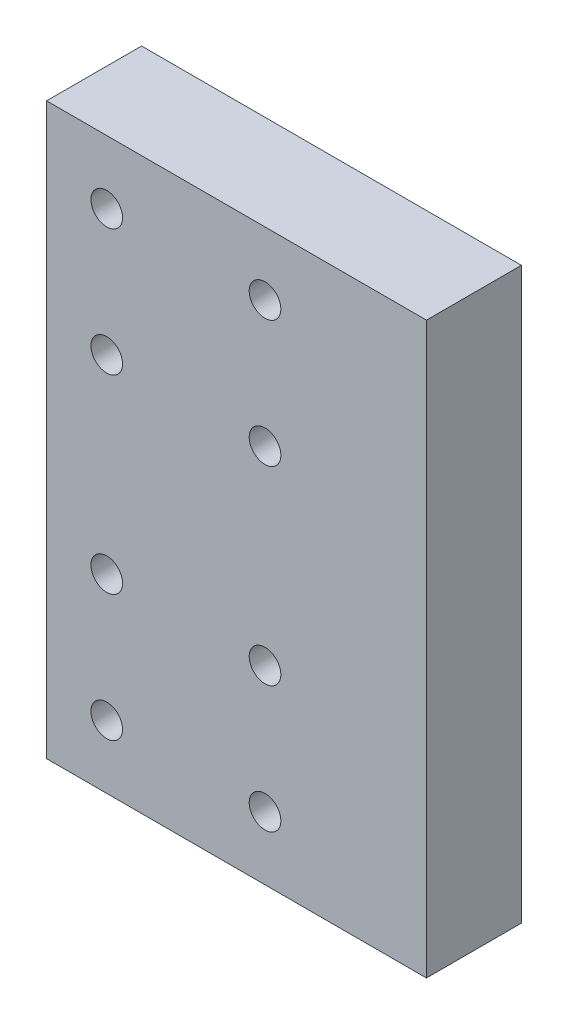
ISO-10303-21;
HEADER;
FILE_DESCRIPTION(('STEP AP214'),'2;1');
FILE_NAME('part.step','',(''),(''),'','','');
FILE_SCHEMA(('AUTOMOTIVE_DESIGN { 1 0 10303 214 1 1 1 1 }'));
ENDSEC;
DATA;
#1=APPLICATION_CONTEXT('core data for automotive mechanical design processes');
#2=APPLICATION_PROTOCOL_DEFINITION('international standard','automotive_design',2000,#1);
#3=PRODUCT_CONTEXT('',#1,'mechanical');
#4=PRODUCT('Part','Part','',(#3));
#5=PRODUCT_RELATED_PRODUCT_CATEGORY('part','',(#4));
#6=PRODUCT_DEFINITION_FORMATION('','',#4);
#7=PRODUCT_DEFINITION_CONTEXT('part definition',#1,'design');
#8=PRODUCT_DEFINITION('design','',#6,#7);
#9=PRODUCT_DEFINITION_SHAPE('','',#8);
#10=(LENGTH_UNIT() NAMED_UNIT(*) SI_UNIT(.MILLI.,.METRE.));
#11=(NAMED_UNIT(*) PLANE_ANGLE_UNIT() SI_UNIT($,.RADIAN.));
#12=(NAMED_UNIT(*) SI_UNIT($,.STERADIAN.) SOLID_ANGLE_UNIT());
#13=UNCERTAINTY_MEASURE_WITH_UNIT(LENGTH_MEASURE(1.E-05),#10,'distance_accuracy_value','');
#14=(GEOMETRIC_REPRESENTATION_CONTEXT(3) GLOBAL_UNCERTAINTY_ASSIGNED_CONTEXT((#13)) GLOBAL_UNIT_ASSIGNED_CONTEXT((#10,
#11,#12)) REPRESENTATION_CONTEXT('',''));
#15=CARTESIAN_POINT('',(0.,0.,0.));
#16=DIRECTION('',(0.,0.,1.));
#17=DIRECTION('',(1.,0.,0.));
#18=AXIS2_PLACEMENT_3D('',#15,#16,#17);
#19=CARTESIAN_POINT('',(0.,0.,15.));
#20=DIRECTION('',(1.,0.,0.));
#21=DIRECTION('',(0.,0.,-1.));
#22=AXIS2_PLACEMENT_3D('',#19,#20,#21);
#23=PLANE('',#22);
#24=DIRECTION('',(0.,-1.,0.));
#25=VECTOR('',#24,1.);
#26=CARTESIAN_POINT('',(0.,0.,0.));
#27=LINE('',#26,#25);
#28=CARTESIAN_POINT('',(0.,90.,0.));
#29=VERTEX_POINT('',#28);
#30=CARTESIAN_POINT('',(0.,0.,0.));
#31=VERTEX_POINT('',#30);
#32=EDGE_CURVE('E96',#29,#31,#27,.T.);
#33=ORIENTED_EDGE('',*,*,#32,.T.);
#34=DIRECTION('',(0.,0.,-1.));
#35=VECTOR('',#34,1.);
#36=CARTESIAN_POINT('',(0.,0.,15.));
#37=LINE('',#36,#35);
#38=CARTESIAN_POINT('',(0.,0.,15.));
#39=VERTEX_POINT('',#38);
#40=EDGE_CURVE('E11',#39,#31,#37,.T.);
#41=ORIENTED_EDGE('',*,*,#40,.F.);
#42=DIRECTION('',(0.,-1.,0.));
#43=VECTOR('',#42,1.);
#44=CARTESIAN_POINT('',(0.,0.,15.));
#45=LINE('',#44,#43);
#46=CARTESIAN_POINT('',(0.,90.,15.));
#47=VERTEX_POINT('',#46);
#48=EDGE_CURVE('E84',#47,#39,#45,.T.);
#49=ORIENTED_EDGE('',*,*,#48,.F.);
#50=DIRECTION('',(0.,0.,-1.));
#51=VECTOR('',#50,1.);
#52=CARTESIAN_POINT('',(0.,90.,15.));
#53=LINE('',#52,#51);
#54=EDGE_CURVE('E92',#47,#29,#53,.T.);
#55=ORIENTED_EDGE('',*,*,#54,.T.);
#56=EDGE_LOOP('',(#33,#41,#49,#55));
#57=FACE_BOUND('',#56,.T.);
#58=ADVANCED_FACE('F33',(#57),#23,.F.);
#59=CARTESIAN_POINT('',(0.,0.,15.));
#60=DIRECTION('',(0.,1.,0.));
#61=DIRECTION('',(0.,0.,1.));
#62=AXIS2_PLACEMENT_3D('',#59,#60,#61);
#63=PLANE('',#62);
#64=DIRECTION('',(1.,0.,0.));
#65=VECTOR('',#64,1.);
#66=CARTESIAN_POINT('',(0.,0.,0.));
#67=LINE('',#66,#65);
#68=CARTESIAN_POINT('',(60.,0.,0.));
#69=VERTEX_POINT('',#68);
#70=EDGE_CURVE('E88',#31,#69,#67,.T.);
#71=ORIENTED_EDGE('',*,*,#70,.T.);
#72=DIRECTION('',(0.,0.,-1.));
#73=VECTOR('',#72,1.);
#74=CARTESIAN_POINT('',(60.,0.,15.));
#75=LINE('',#74,#73);
#76=CARTESIAN_POINT('',(60.,0.,15.));
#77=VERTEX_POINT('',#76);
#78=EDGE_CURVE('E41',#77,#69,#75,.T.);
#79=ORIENTED_EDGE('',*,*,#78,.F.);
#80=DIRECTION('',(1.,0.,0.));
#81=VECTOR('',#80,1.);
#82=CARTESIAN_POINT('',(0.,0.,15.));
#83=LINE('',#82,#81);
#84=EDGE_CURVE('E79',#39,#77,#83,.T.);
#85=ORIENTED_EDGE('',*,*,#84,.F.);
#86=ORIENTED_EDGE('',*,*,#40,.T.);
#87=EDGE_LOOP('',(#71,#79,#85,#86));
#88=FACE_BOUND('',#87,.T.);
#89=ADVANCED_FACE('F87',(#88),#63,.F.);
#90=CARTESIAN_POINT('',(60.,0.,15.));
#91=DIRECTION('',(-1.,0.,0.));
#92=DIRECTION('',(0.,0.,1.));
#93=AXIS2_PLACEMENT_3D('',#90,#91,#92);
#94=PLANE('',#93);
#95=DIRECTION('',(0.,1.,0.));
#96=VECTOR('',#95,1.);
#97=CARTESIAN_POINT('',(60.,0.,0.));
#98=LINE('',#97,#96);
#99=CARTESIAN_POINT('',(60.,90.,0.));
#100=VERTEX_POINT('',#99);
#101=EDGE_CURVE('E66',#69,#100,#98,.T.);
#102=ORIENTED_EDGE('',*,*,#101,.T.);
#103=DIRECTION('',(0.,0.,-1.));
#104=VECTOR('',#103,1.);
#105=CARTESIAN_POINT('',(60.,90.,15.));
#106=LINE('',#105,#104);
#107=CARTESIAN_POINT('',(60.,90.,15.));
#108=VERTEX_POINT('',#107);
#109=EDGE_CURVE('E89',#108,#100,#106,.T.);
#110=ORIENTED_EDGE('',*,*,#109,.F.);
#111=DIRECTION('',(0.,1.,0.));
#112=VECTOR('',#111,1.);
#113=CARTESIAN_POINT('',(60.,0.,15.));
#114=LINE('',#113,#112);
#115=EDGE_CURVE('E82',#77,#108,#114,.T.);
#116=ORIENTED_EDGE('',*,*,#115,.F.);
#117=ORIENTED_EDGE('',*,*,#78,.T.);
#118=EDGE_LOOP('',(#102,#110,#116,#117));
#119=FACE_BOUND('',#118,.T.);
#120=ADVANCED_FACE('F90',(#119),#94,.F.);
#121=CARTESIAN_POINT('',(0.,90.,15.));
#122=DIRECTION('',(0.,-1.,0.));
#123=DIRECTION('',(0.,0.,-1.));
#124=AXIS2_PLACEMENT_3D('',#121,#122,#123);
#125=PLANE('',#124);
#126=DIRECTION('',(-1.,0.,0.));
#127=VECTOR('',#126,1.);
#128=CARTESIAN_POINT('',(0.,90.,0.));
#129=LINE('',#128,#127);
#130=EDGE_CURVE('E72',#100,#29,#129,.T.);
#131=ORIENTED_EDGE('',*,*,#130,.T.);
#132=ORIENTED_EDGE('',*,*,#54,.F.);
#133=DIRECTION('',(-1.,0.,0.));
#134=VECTOR('',#133,1.);
#135=CARTESIAN_POINT('',(0.,90.,15.));
#136=LINE('',#135,#134);
#137=EDGE_CURVE('E49',#108,#47,#136,.T.);
#138=ORIENTED_EDGE('',*,*,#137,.F.);
#139=ORIENTED_EDGE('',*,*,#109,.T.);
#140=EDGE_LOOP('',(#131,#132,#138,#139));
#141=FACE_BOUND('',#140,.T.);
#142=ADVANCED_FACE('F104',(#141),#125,.F.);
#143=CARTESIAN_POINT('',(0.,0.,15.));
#144=DIRECTION('',(0.,0.,-1.));
#145=DIRECTION('',(-1.,0.,0.));
#146=AXIS2_PLACEMENT_3D('',#143,#144,#145);
#147=PLANE('',#146);
#148=CARTESIAN_POINT('',(34.5,10.,15.));
#149=DIRECTION('',(0.,0.,-1.));
#150=DIRECTION('',(-1.,0.,0.));
#151=AXIS2_PLACEMENT_3D('',#148,#149,#150);
#152=CIRCLE('',#151,2.5);
#153=CARTESIAN_POINT('',(32.,10.,15.));
#154=VERTEX_POINT('',#153);
#155=EDGE_CURVE('E115',#154,#154,#152,.T.);
#156=ORIENTED_EDGE('',*,*,#155,.T.);
#157=EDGE_LOOP('',(#156));
#158=FACE_BOUND('',#157,.T.);
#159=CARTESIAN_POINT('',(34.5,30.,15.));
#160=DIRECTION('',(0.,0.,-1.));
#161=DIRECTION('',(-1.,0.,0.));
#162=AXIS2_PLACEMENT_3D('',#159,#160,#161);
#163=CIRCLE('',#162,2.49999999999999);
#164=CARTESIAN_POINT('',(32.,30.,15.));
#165=VERTEX_POINT('',#164);
#166=EDGE_CURVE('E118',#165,#165,#163,.T.);
#167=ORIENTED_EDGE('',*,*,#166,.T.);
#168=EDGE_LOOP('',(#167));
#169=FACE_BOUND('',#168,.T.);
#170=CARTESIAN_POINT('',(9.5,30.,15.));
#171=DIRECTION('',(0.,0.,-1.));
#172=DIRECTION('',(-1.,0.,0.));
#173=AXIS2_PLACEMENT_3D('',#170,#171,#172);
#174=CIRCLE('',#173,2.5);
#175=CARTESIAN_POINT('',(7.,30.,15.));
#176=VERTEX_POINT('',#175);
#177=EDGE_CURVE('E121',#176,#176,#174,.T.);
#178=ORIENTED_EDGE('',*,*,#177,.T.);
#179=EDGE_LOOP('',(#178));
#180=FACE_BOUND('',#179,.T.);
#181=CARTESIAN_POINT('',(9.5,60.,15.));
#182=DIRECTION('',(0.,0.,-1.));
#183=DIRECTION('',(-1.,0.,0.));
#184=AXIS2_PLACEMENT_3D('',#181,#182,#183);
#185=CIRCLE('',#184,2.5);
#186=CARTESIAN_POINT('',(7.,60.,15.));
#187=VERTEX_POINT('',#186);
#188=EDGE_CURVE('E124',#187,#187,#185,.T.);
#189=ORIENTED_EDGE('',*,*,#188,.T.);
#190=EDGE_LOOP('',(#189));
#191=FACE_BOUND('',#190,.T.);
#192=CARTESIAN_POINT('',(34.5,60.,15.));
#193=DIRECTION('',(0.,0.,-1.));
#194=DIRECTION('',(-1.,0.,0.));
#195=AXIS2_PLACEMENT_3D('',#192,#193,#194);
#196=CIRCLE('',#195,2.5);
#197=CARTESIAN_POINT('',(32.,60.,15.));
#198=VERTEX_POINT('',#197);
#199=EDGE_CURVE('E127',#198,#198,#196,.T.);
#200=ORIENTED_EDGE('',*,*,#199,.T.);
#201=EDGE_LOOP('',(#200));
#202=FACE_BOUND('',#201,.T.);
#203=CARTESIAN_POINT('',(34.5,80.,15.));
#204=DIRECTION('',(0.,0.,-1.));
#205=DIRECTION('',(-1.,0.,0.));
#206=AXIS2_PLACEMENT_3D('',#203,#204,#205);
#207=CIRCLE('',#206,2.5);
#208=CARTESIAN_POINT('',(32.,80.,15.));
#209=VERTEX_POINT('',#208);
#210=EDGE_CURVE('E130',#209,#209,#207,.T.);
#211=ORIENTED_EDGE('',*,*,#210,.T.);
#212=EDGE_LOOP('',(#211));
#213=FACE_BOUND('',#212,.T.);
#214=CARTESIAN_POINT('',(9.5,80.,15.));
#215=DIRECTION('',(0.,0.,-1.));
#216=DIRECTION('',(-1.,0.,0.));
#217=AXIS2_PLACEMENT_3D('',#214,#215,#216);
#218=CIRCLE('',#217,2.5);
#219=CARTESIAN_POINT('',(7.,80.,15.));
#220=VERTEX_POINT('',#219);
#221=EDGE_CURVE('E133',#220,#220,#218,.T.);
#222=ORIENTED_EDGE('',*,*,#221,.T.);
#223=EDGE_LOOP('',(#222));
#224=FACE_BOUND('',#223,.T.);
#225=CARTESIAN_POINT('',(9.5,10.,15.));
#226=DIRECTION('',(0.,0.,-1.));
#227=DIRECTION('',(-1.,0.,0.));
#228=AXIS2_PLACEMENT_3D('',#225,#226,#227);
#229=CIRCLE('',#228,2.5);
#230=CARTESIAN_POINT('',(7.,10.,15.));
#231=VERTEX_POINT('',#230);
#232=EDGE_CURVE('E99',#231,#231,#229,.T.);
#233=ORIENTED_EDGE('',*,*,#232,.T.);
#234=EDGE_LOOP('',(#233));
#235=FACE_BOUND('',#234,.T.);
#236=ORIENTED_EDGE('',*,*,#48,.T.);
#237=ORIENTED_EDGE('',*,*,#84,.T.);
#238=ORIENTED_EDGE('',*,*,#115,.T.);
#239=ORIENTED_EDGE('',*,*,#137,.T.);
#240=EDGE_LOOP('',(#236,#237,#238,#239));
#241=FACE_BOUND('',#240,.T.);
#242=ADVANCED_FACE('F80',(#158,#169,#180,#191,#202,#213,#224,#235,#241),#147,.F.);
#243=CARTESIAN_POINT('',(0.,0.,0.));
#244=DIRECTION('',(0.,0.,-1.));
#245=DIRECTION('',(-1.,0.,0.));
#246=AXIS2_PLACEMENT_3D('',#243,#244,#245);
#247=PLANE('',#246);
#248=CARTESIAN_POINT('',(34.5,10.,0.));
#249=DIRECTION('',(0.,0.,1.));
#250=DIRECTION('',(-1.,0.,0.));
#251=AXIS2_PLACEMENT_3D('',#248,#249,#250);
#252=CIRCLE('',#251,2.5);
#253=CARTESIAN_POINT('',(32.,10.,0.));
#254=VERTEX_POINT('',#253);
#255=EDGE_CURVE('E136',#254,#254,#252,.T.);
#256=ORIENTED_EDGE('',*,*,#255,.T.);
#257=EDGE_LOOP('',(#256));
#258=FACE_BOUND('',#257,.T.);
#259=CARTESIAN_POINT('',(34.5,30.,0.));
#260=DIRECTION('',(0.,0.,1.));
#261=DIRECTION('',(1.,0.,0.));
#262=AXIS2_PLACEMENT_3D('',#259,#260,#261);
#263=CIRCLE('',#262,2.49999999999999);
#264=CARTESIAN_POINT('',(37.,30.,0.));
#265=VERTEX_POINT('',#264);
#266=EDGE_CURVE('E152',#265,#265,#263,.T.);
#267=ORIENTED_EDGE('',*,*,#266,.T.);
#268=EDGE_LOOP('',(#267));
#269=FACE_BOUND('',#268,.T.);
#270=CARTESIAN_POINT('',(9.5,30.,0.));
#271=DIRECTION('',(0.,0.,1.));
#272=DIRECTION('',(-1.,0.,0.));
#273=AXIS2_PLACEMENT_3D('',#270,#271,#272);
#274=CIRCLE('',#273,2.5);
#275=CARTESIAN_POINT('',(7.,30.,0.));
#276=VERTEX_POINT('',#275);
#277=EDGE_CURVE('E149',#276,#276,#274,.T.);
#278=ORIENTED_EDGE('',*,*,#277,.T.);
#279=EDGE_LOOP('',(#278));
#280=FACE_BOUND('',#279,.T.);
#281=CARTESIAN_POINT('',(9.5,60.,0.));
#282=DIRECTION('',(0.,0.,1.));
#283=DIRECTION('',(1.,0.,0.));
#284=AXIS2_PLACEMENT_3D('',#281,#282,#283);
#285=CIRCLE('',#284,2.5);
#286=CARTESIAN_POINT('',(12.,60.,0.));
#287=VERTEX_POINT('',#286);
#288=EDGE_CURVE('E146',#287,#287,#285,.T.);
#289=ORIENTED_EDGE('',*,*,#288,.T.);
#290=EDGE_LOOP('',(#289));
#291=FACE_BOUND('',#290,.T.);
#292=CARTESIAN_POINT('',(34.5,60.,0.));
#293=DIRECTION('',(0.,0.,1.));
#294=DIRECTION('',(-1.,0.,0.));
#295=AXIS2_PLACEMENT_3D('',#292,#293,#294);
#296=CIRCLE('',#295,2.5);
#297=CARTESIAN_POINT('',(32.,60.,0.));
#298=VERTEX_POINT('',#297);
#299=EDGE_CURVE('E143',#298,#298,#296,.T.);
#300=ORIENTED_EDGE('',*,*,#299,.T.);
#301=EDGE_LOOP('',(#300));
#302=FACE_BOUND('',#301,.T.);
#303=CARTESIAN_POINT('',(34.5,80.,0.));
#304=DIRECTION('',(0.,0.,1.));
#305=DIRECTION('',(1.,0.,0.));
#306=AXIS2_PLACEMENT_3D('',#303,#304,#305);
#307=CIRCLE('',#306,2.5);
#308=CARTESIAN_POINT('',(37.,80.,0.));
#309=VERTEX_POINT('',#308);
#310=EDGE_CURVE('E140',#309,#309,#307,.T.);
#311=ORIENTED_EDGE('',*,*,#310,.T.);
#312=EDGE_LOOP('',(#311));
#313=FACE_BOUND('',#312,.T.);
#314=CARTESIAN_POINT('',(9.5,80.,0.));
#315=DIRECTION('',(0.,0.,1.));
#316=DIRECTION('',(-1.,0.,0.));
#317=AXIS2_PLACEMENT_3D('',#314,#315,#316);
#318=CIRCLE('',#317,2.5);
#319=CARTESIAN_POINT('',(7.,80.,0.));
#320=VERTEX_POINT('',#319);
#321=EDGE_CURVE('E137',#320,#320,#318,.T.);
#322=ORIENTED_EDGE('',*,*,#321,.T.);
#323=EDGE_LOOP('',(#322));
#324=FACE_BOUND('',#323,.T.);
#325=CARTESIAN_POINT('',(9.5,10.,0.));
#326=DIRECTION('',(0.,0.,1.));
#327=DIRECTION('',(1.,0.,0.));
#328=AXIS2_PLACEMENT_3D('',#325,#326,#327);
#329=CIRCLE('',#328,2.5);
#330=CARTESIAN_POINT('',(12.,10.,0.));
#331=VERTEX_POINT('',#330);
#332=EDGE_CURVE('E112',#331,#331,#329,.T.);
#333=ORIENTED_EDGE('',*,*,#332,.T.);
#334=EDGE_LOOP('',(#333));
#335=FACE_BOUND('',#334,.T.);
#336=ORIENTED_EDGE('',*,*,#32,.F.);
#337=ORIENTED_EDGE('',*,*,#130,.F.);
#338=ORIENTED_EDGE('',*,*,#101,.F.);
#339=ORIENTED_EDGE('',*,*,#70,.F.);
#340=EDGE_LOOP('',(#336,#337,#338,#339));
#341=FACE_BOUND('',#340,.T.);
#342=ADVANCED_FACE('F107',(#258,#269,#280,#291,#302,#313,#324,#335,#341),#247,.T.);
#343=CARTESIAN_POINT('',(9.5,10.,0.));
#344=DIRECTION('',(0.,0.,1.));
#345=DIRECTION('',(1.,0.,0.));
#346=AXIS2_PLACEMENT_3D('',#343,#344,#345);
#347=CYLINDRICAL_SURFACE('',#346,2.5);
#348=ORIENTED_EDGE('',*,*,#332,.F.);
#349=EDGE_LOOP('',(#348));
#350=FACE_BOUND('',#349,.T.);
#351=ORIENTED_EDGE('',*,*,#232,.F.);
#352=EDGE_LOOP('',(#351));
#353=FACE_BOUND('',#352,.T.);
#354=ADVANCED_FACE('F184',(#350,#353),#347,.F.);
#355=CARTESIAN_POINT('',(9.5,80.,0.));
#356=DIRECTION('',(0.,0.,1.));
#357=DIRECTION('',(1.,0.,0.));
#358=AXIS2_PLACEMENT_3D('',#355,#356,#357);
#359=CYLINDRICAL_SURFACE('',#358,2.5);
#360=ORIENTED_EDGE('',*,*,#321,.F.);
#361=EDGE_LOOP('',(#360));
#362=FACE_BOUND('',#361,.T.);
#363=ORIENTED_EDGE('',*,*,#221,.F.);
#364=EDGE_LOOP('',(#363));
#365=FACE_BOUND('',#364,.T.);
#366=ADVANCED_FACE('F186',(#362,#365),#359,.F.);
#367=CARTESIAN_POINT('',(34.5,80.,0.));
#368=DIRECTION('',(0.,0.,1.));
#369=DIRECTION('',(1.,0.,0.));
#370=AXIS2_PLACEMENT_3D('',#367,#368,#369);
#371=CYLINDRICAL_SURFACE('',#370,2.5);
#372=ORIENTED_EDGE('',*,*,#310,.F.);
#373=EDGE_LOOP('',(#372));
#374=FACE_BOUND('',#373,.T.);
#375=ORIENTED_EDGE('',*,*,#210,.F.);
#376=EDGE_LOOP('',(#375));
#377=FACE_BOUND('',#376,.T.);
#378=ADVANCED_FACE('F193',(#374,#377),#371,.F.);
#379=CARTESIAN_POINT('',(34.5,60.,0.));
#380=DIRECTION('',(0.,0.,1.));
#381=DIRECTION('',(1.,0.,0.));
#382=AXIS2_PLACEMENT_3D('',#379,#380,#381);
#383=CYLINDRICAL_SURFACE('',#382,2.5);
#384=ORIENTED_EDGE('',*,*,#299,.F.);
#385=EDGE_LOOP('',(#384));
#386=FACE_BOUND('',#385,.T.);
#387=ORIENTED_EDGE('',*,*,#199,.F.);
#388=EDGE_LOOP('',(#387));
#389=FACE_BOUND('',#388,.T.);
#390=ADVANCED_FACE('F239',(#386,#389),#383,.F.);
#391=CARTESIAN_POINT('',(9.5,60.,0.));
#392=DIRECTION('',(0.,0.,1.));
#393=DIRECTION('',(1.,0.,0.));
#394=AXIS2_PLACEMENT_3D('',#391,#392,#393);
#395=CYLINDRICAL_SURFACE('',#394,2.5);
#396=ORIENTED_EDGE('',*,*,#288,.F.);
#397=EDGE_LOOP('',(#396));
#398=FACE_BOUND('',#397,.T.);
#399=ORIENTED_EDGE('',*,*,#188,.F.);
#400=EDGE_LOOP('',(#399));
#401=FACE_BOUND('',#400,.T.);
#402=ADVANCED_FACE('F249',(#398,#401),#395,.F.);
#403=CARTESIAN_POINT('',(9.5,30.,0.));
#404=DIRECTION('',(0.,0.,1.));
#405=DIRECTION('',(1.,0.,0.));
#406=AXIS2_PLACEMENT_3D('',#403,#404,#405);
#407=CYLINDRICAL_SURFACE('',#406,2.5);
#408=ORIENTED_EDGE('',*,*,#277,.F.);
#409=EDGE_LOOP('',(#408));
#410=FACE_BOUND('',#409,.T.);
#411=ORIENTED_EDGE('',*,*,#177,.F.);
#412=EDGE_LOOP('',(#411));
#413=FACE_BOUND('',#412,.T.);
#414=ADVANCED_FACE('F259',(#410,#413),#407,.F.);
#415=CARTESIAN_POINT('',(34.5,30.,0.));
#416=DIRECTION('',(0.,0.,1.));
#417=DIRECTION('',(1.,0.,0.));
#418=AXIS2_PLACEMENT_3D('',#415,#416,#417);
#419=CYLINDRICAL_SURFACE('',#418,2.49999999999999);
#420=ORIENTED_EDGE('',*,*,#266,.F.);
#421=EDGE_LOOP('',(#420));
#422=FACE_BOUND('',#421,.T.);
#423=ORIENTED_EDGE('',*,*,#166,.F.);
#424=EDGE_LOOP('',(#423));
#425=FACE_BOUND('',#424,.T.);
#426=ADVANCED_FACE('F163',(#422,#425),#419,.F.);
#427=CARTESIAN_POINT('',(34.5,10.,0.));
#428=DIRECTION('',(0.,0.,1.));
#429=DIRECTION('',(1.,0.,0.));
#430=AXIS2_PLACEMENT_3D('',#427,#428,#429);
#431=CYLINDRICAL_SURFACE('',#430,2.5);
#432=ORIENTED_EDGE('',*,*,#255,.F.);
#433=EDGE_LOOP('',(#432));
#434=FACE_BOUND('',#433,.T.);
#435=ORIENTED_EDGE('',*,*,#155,.F.);
#436=EDGE_LOOP('',(#435));
#437=FACE_BOUND('',#436,.T.);
#438=ADVANCED_FACE('F160',(#434,#437),#431,.F.);
#439=CLOSED_SHELL('',(#58,#89,#120,#142,#242,#342,#354,#366,#378,#390,#402,#414,#426,#438));
#440=MANIFOLD_SOLID_BREP('B2',#439);
#441=ADVANCED_BREP_SHAPE_REPRESENTATION('',(#18,#440),#14);
#442=SHAPE_DEFINITION_REPRESENTATION(#9,#441);
ENDSEC;
END-ISO-10303-21;
